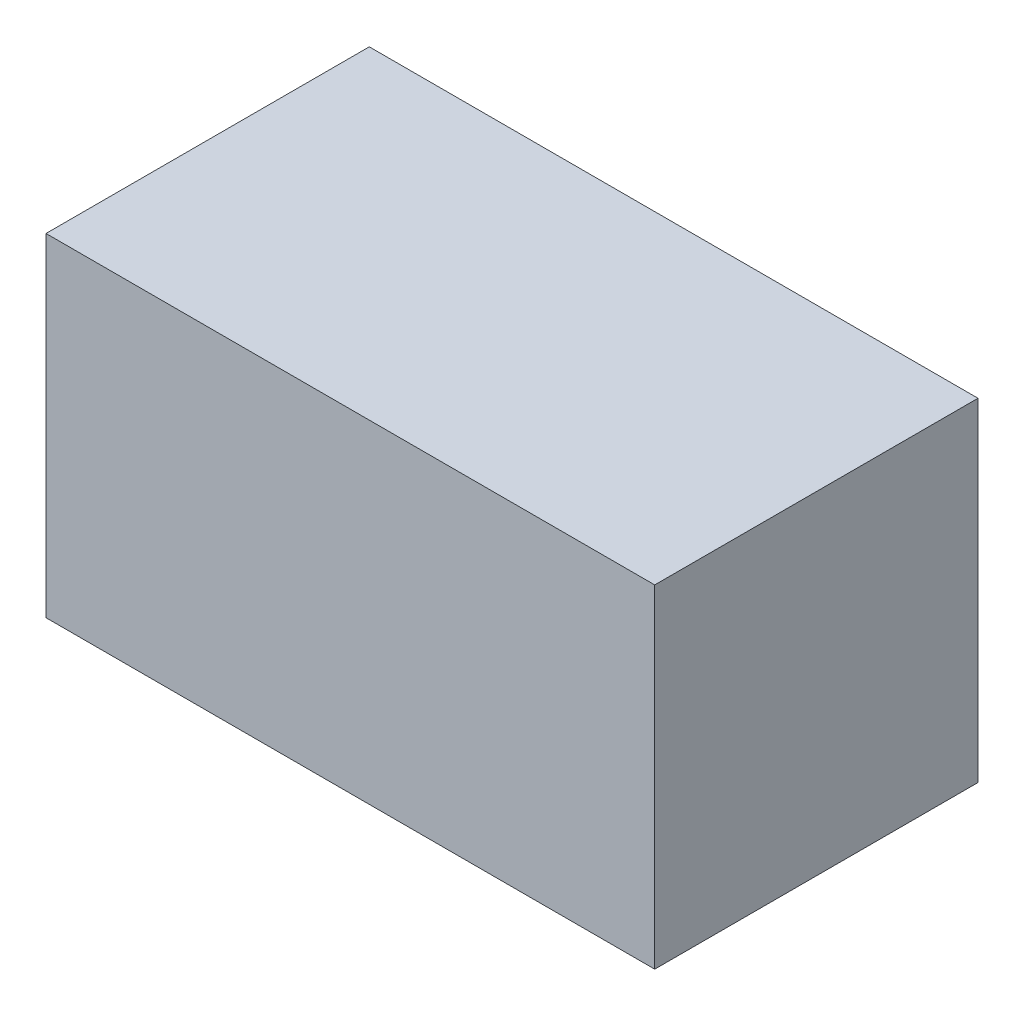
ISO-10303-21;
HEADER;
FILE_DESCRIPTION(('STEP AP214'),'2;1');
FILE_NAME('part.step','',(''),(''),'','','');
FILE_SCHEMA(('AUTOMOTIVE_DESIGN { 1 0 10303 214 1 1 1 1 }'));
ENDSEC;
DATA;
#1=APPLICATION_CONTEXT('core data for automotive mechanical design processes');
#2=APPLICATION_PROTOCOL_DEFINITION('international standard','automotive_design',2000,#1);
#3=PRODUCT_CONTEXT('',#1,'mechanical');
#4=PRODUCT('Part','Part','',(#3));
#5=PRODUCT_RELATED_PRODUCT_CATEGORY('part','',(#4));
#6=PRODUCT_DEFINITION_FORMATION('','',#4);
#7=PRODUCT_DEFINITION_CONTEXT('part definition',#1,'design');
#8=PRODUCT_DEFINITION('design','',#6,#7);
#9=PRODUCT_DEFINITION_SHAPE('','',#8);
#10=(LENGTH_UNIT() NAMED_UNIT(*) SI_UNIT(.MILLI.,.METRE.));
#11=(NAMED_UNIT(*) PLANE_ANGLE_UNIT() SI_UNIT($,.RADIAN.));
#12=(NAMED_UNIT(*) SI_UNIT($,.STERADIAN.) SOLID_ANGLE_UNIT());
#13=UNCERTAINTY_MEASURE_WITH_UNIT(LENGTH_MEASURE(1.E-05),#10,'distance_accuracy_value','');
#14=(GEOMETRIC_REPRESENTATION_CONTEXT(3) GLOBAL_UNCERTAINTY_ASSIGNED_CONTEXT((#13)) GLOBAL_UNIT_ASSIGNED_CONTEXT((#10,
#11,#12)) REPRESENTATION_CONTEXT('',''));
#15=CARTESIAN_POINT('',(0.,0.,0.));
#16=DIRECTION('',(0.,0.,1.));
#17=DIRECTION('',(1.,0.,0.));
#18=AXIS2_PLACEMENT_3D('',#15,#16,#17);
#19=CARTESIAN_POINT('',(36.417930197076,4.73229293339714,1.7018));
#20=DIRECTION('',(-1.,0.,0.));
#21=DIRECTION('',(0.,0.,1.));
#22=AXIS2_PLACEMENT_3D('',#19,#20,#21);
#23=PLANE('',#22);
#24=DIRECTION('',(0.,1.,0.));
#25=VECTOR('',#24,1.);
#26=CARTESIAN_POINT('',(36.417930197076,3.23957949899492,1.7018));
#27=LINE('',#26,#25);
#28=CARTESIAN_POINT('',(36.417930197076,3.23957949899492,1.7018));
#29=VERTEX_POINT('',#28);
#30=CARTESIAN_POINT('',(36.417930197076,4.73229293339714,1.7018));
#31=VERTEX_POINT('',#30);
#32=EDGE_CURVE('E82',#29,#31,#27,.T.);
#33=ORIENTED_EDGE('',*,*,#32,.F.);
#34=DIRECTION('',(0.,0.,1.));
#35=VECTOR('',#34,1.);
#36=CARTESIAN_POINT('',(36.417930197076,3.23957949899492,1.7018));
#37=LINE('',#36,#35);
#38=CARTESIAN_POINT('',(36.417930197076,3.23957949899492,3.1518));
#39=VERTEX_POINT('',#38);
#40=EDGE_CURVE('E20',#29,#39,#37,.T.);
#41=ORIENTED_EDGE('',*,*,#40,.T.);
#42=DIRECTION('',(0.,-1.,0.));
#43=VECTOR('',#42,1.);
#44=CARTESIAN_POINT('',(36.417930197076,3.23957949899492,3.1518));
#45=LINE('',#44,#43);
#46=CARTESIAN_POINT('',(36.417930197076,4.73229293339714,3.1518));
#47=VERTEX_POINT('',#46);
#48=EDGE_CURVE('E104',#47,#39,#45,.T.);
#49=ORIENTED_EDGE('',*,*,#48,.F.);
#50=DIRECTION('',(0.,0.,1.));
#51=VECTOR('',#50,1.);
#52=CARTESIAN_POINT('',(36.417930197076,4.73229293339714,1.7018));
#53=LINE('',#52,#51);
#54=EDGE_CURVE('E11',#31,#47,#53,.T.);
#55=ORIENTED_EDGE('',*,*,#54,.F.);
#56=EDGE_LOOP('',(#33,#41,#49,#55));
#57=FACE_BOUND('',#56,.T.);
#58=ADVANCED_FACE('F16',(#57),#23,.T.);
#59=CARTESIAN_POINT('',(39.1481923762392,4.73229293339714,1.7018));
#60=DIRECTION('',(0.,1.,0.));
#61=DIRECTION('',(1.,0.,0.));
#62=AXIS2_PLACEMENT_3D('',#59,#60,#61);
#63=PLANE('',#62);
#64=DIRECTION('',(1.,0.,0.));
#65=VECTOR('',#64,1.);
#66=CARTESIAN_POINT('',(36.417930197076,4.73229293339714,1.7018));
#67=LINE('',#66,#65);
#68=CARTESIAN_POINT('',(39.1481923762392,4.73229293339714,1.7018));
#69=VERTEX_POINT('',#68);
#70=EDGE_CURVE('E86',#31,#69,#67,.T.);
#71=ORIENTED_EDGE('',*,*,#70,.F.);
#72=ORIENTED_EDGE('',*,*,#54,.T.);
#73=DIRECTION('',(-1.,0.,0.));
#74=VECTOR('',#73,1.);
#75=CARTESIAN_POINT('',(36.417930197076,4.73229293339714,3.1518));
#76=LINE('',#75,#74);
#77=CARTESIAN_POINT('',(39.1481923762392,4.73229293339714,3.1518));
#78=VERTEX_POINT('',#77);
#79=EDGE_CURVE('E100',#78,#47,#76,.T.);
#80=ORIENTED_EDGE('',*,*,#79,.F.);
#81=DIRECTION('',(0.,0.,1.));
#82=VECTOR('',#81,1.);
#83=CARTESIAN_POINT('',(39.1481923762392,4.73229293339714,1.7018));
#84=LINE('',#83,#82);
#85=EDGE_CURVE('E27',#69,#78,#84,.T.);
#86=ORIENTED_EDGE('',*,*,#85,.F.);
#87=EDGE_LOOP('',(#71,#72,#80,#86));
#88=FACE_BOUND('',#87,.T.);
#89=ADVANCED_FACE('F119',(#88),#63,.T.);
#90=CARTESIAN_POINT('',(39.1481923762392,3.23957949899492,1.7018));
#91=DIRECTION('',(1.,0.,0.));
#92=DIRECTION('',(0.,1.,0.));
#93=AXIS2_PLACEMENT_3D('',#90,#91,#92);
#94=PLANE('',#93);
#95=DIRECTION('',(0.,-1.,0.));
#96=VECTOR('',#95,1.);
#97=CARTESIAN_POINT('',(39.1481923762392,4.73229293339714,1.7018));
#98=LINE('',#97,#96);
#99=CARTESIAN_POINT('',(39.1481923762392,3.23957949899492,1.7018));
#100=VERTEX_POINT('',#99);
#101=EDGE_CURVE('E88',#69,#100,#98,.T.);
#102=ORIENTED_EDGE('',*,*,#101,.F.);
#103=ORIENTED_EDGE('',*,*,#85,.T.);
#104=DIRECTION('',(0.,1.,0.));
#105=VECTOR('',#104,1.);
#106=CARTESIAN_POINT('',(39.1481923762392,4.73229293339714,3.1518));
#107=LINE('',#106,#105);
#108=CARTESIAN_POINT('',(39.1481923762392,3.23957949899492,3.1518));
#109=VERTEX_POINT('',#108);
#110=EDGE_CURVE('E97',#109,#78,#107,.T.);
#111=ORIENTED_EDGE('',*,*,#110,.F.);
#112=DIRECTION('',(0.,0.,1.));
#113=VECTOR('',#112,1.);
#114=CARTESIAN_POINT('',(39.1481923762392,3.23957949899492,1.7018));
#115=LINE('',#114,#113);
#116=EDGE_CURVE('E61',#100,#109,#115,.T.);
#117=ORIENTED_EDGE('',*,*,#116,.F.);
#118=EDGE_LOOP('',(#102,#103,#111,#117));
#119=FACE_BOUND('',#118,.T.);
#120=ADVANCED_FACE('F122',(#119),#94,.T.);
#121=CARTESIAN_POINT('',(36.417930197076,3.23957949899492,1.7018));
#122=DIRECTION('',(0.,-1.,0.));
#123=DIRECTION('',(0.,0.,-1.));
#124=AXIS2_PLACEMENT_3D('',#121,#122,#123);
#125=PLANE('',#124);
#126=DIRECTION('',(-1.,0.,0.));
#127=VECTOR('',#126,1.);
#128=CARTESIAN_POINT('',(39.1481923762392,3.23957949899492,1.7018));
#129=LINE('',#128,#127);
#130=EDGE_CURVE('E75',#100,#29,#129,.T.);
#131=ORIENTED_EDGE('',*,*,#130,.F.);
#132=ORIENTED_EDGE('',*,*,#116,.T.);
#133=DIRECTION('',(1.,0.,0.));
#134=VECTOR('',#133,1.);
#135=CARTESIAN_POINT('',(39.1481923762392,3.23957949899492,3.1518));
#136=LINE('',#135,#134);
#137=EDGE_CURVE('E77',#39,#109,#136,.T.);
#138=ORIENTED_EDGE('',*,*,#137,.F.);
#139=ORIENTED_EDGE('',*,*,#40,.F.);
#140=EDGE_LOOP('',(#131,#132,#138,#139));
#141=FACE_BOUND('',#140,.T.);
#142=ADVANCED_FACE('F73',(#141),#125,.T.);
#143=CARTESIAN_POINT('',(37.7830612866575,3.98593621619603,3.1518));
#144=DIRECTION('',(0.,0.,1.));
#145=DIRECTION('',(1.,0.,0.));
#146=AXIS2_PLACEMENT_3D('',#143,#144,#145);
#147=PLANE('',#146);
#148=ORIENTED_EDGE('',*,*,#137,.T.);
#149=ORIENTED_EDGE('',*,*,#110,.T.);
#150=ORIENTED_EDGE('',*,*,#79,.T.);
#151=ORIENTED_EDGE('',*,*,#48,.T.);
#152=EDGE_LOOP('',(#148,#149,#150,#151));
#153=FACE_BOUND('',#152,.T.);
#154=ADVANCED_FACE('F117',(#153),#147,.T.);
#155=CARTESIAN_POINT('',(37.7830612866575,3.98593621619603,1.7018));
#156=DIRECTION('',(0.,0.,1.));
#157=DIRECTION('',(1.,0.,0.));
#158=AXIS2_PLACEMENT_3D('',#155,#156,#157);
#159=PLANE('',#158);
#160=ORIENTED_EDGE('',*,*,#130,.T.);
#161=ORIENTED_EDGE('',*,*,#32,.T.);
#162=ORIENTED_EDGE('',*,*,#70,.T.);
#163=ORIENTED_EDGE('',*,*,#101,.T.);
#164=EDGE_LOOP('',(#160,#161,#162,#163));
#165=FACE_BOUND('',#164,.T.);
#166=ADVANCED_FACE('F18',(#165),#159,.F.);
#167=CLOSED_SHELL('',(#58,#89,#120,#142,#154,#166));
#168=MANIFOLD_SOLID_BREP('B1',#167);
#169=ADVANCED_BREP_SHAPE_REPRESENTATION('',(#18,#168),#14);
#170=SHAPE_DEFINITION_REPRESENTATION(#9,#169);
ENDSEC;
END-ISO-10303-21;
